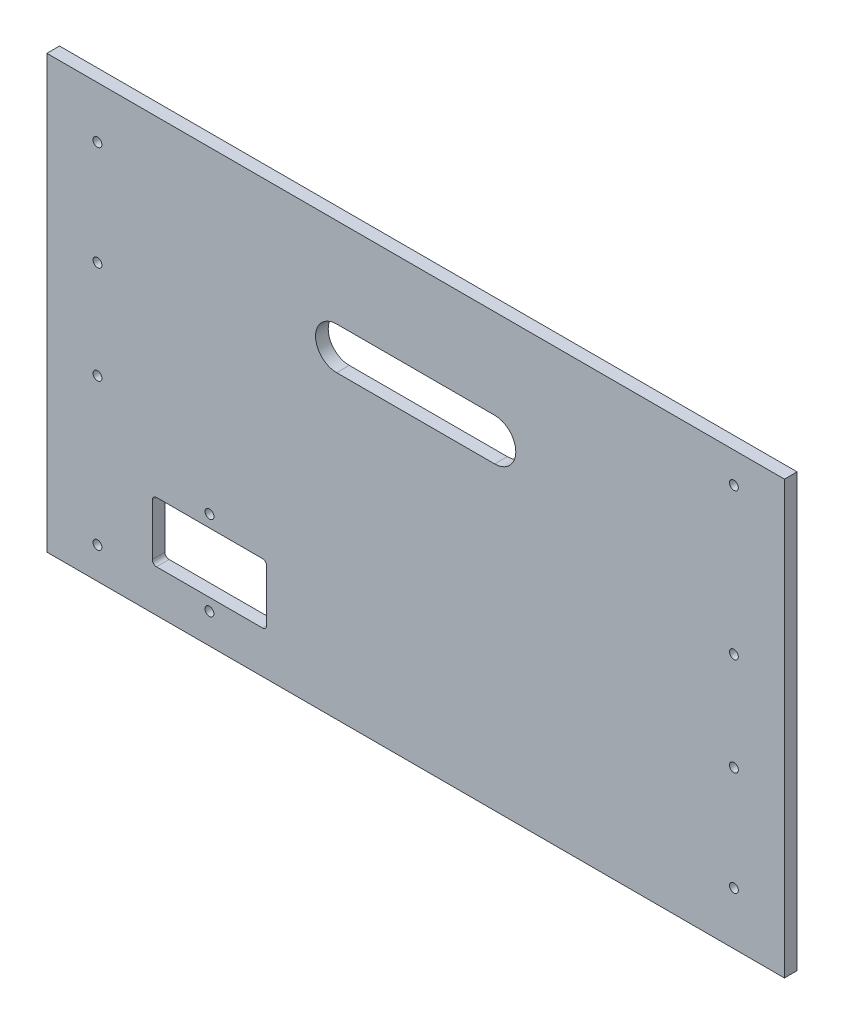
ISO-10303-21;
HEADER;
FILE_DESCRIPTION(('STEP AP214'),'2;1');
FILE_NAME('part.step','',(''),(''),'','','');
FILE_SCHEMA(('AUTOMOTIVE_DESIGN { 1 0 10303 214 1 1 1 1 }'));
ENDSEC;
DATA;
#1=APPLICATION_CONTEXT('core data for automotive mechanical design processes');
#2=APPLICATION_PROTOCOL_DEFINITION('international standard','automotive_design',2000,#1);
#3=PRODUCT_CONTEXT('',#1,'mechanical');
#4=PRODUCT('Part','Part','',(#3));
#5=PRODUCT_RELATED_PRODUCT_CATEGORY('part','',(#4));
#6=PRODUCT_DEFINITION_FORMATION('','',#4);
#7=PRODUCT_DEFINITION_CONTEXT('part definition',#1,'design');
#8=PRODUCT_DEFINITION('design','',#6,#7);
#9=PRODUCT_DEFINITION_SHAPE('','',#8);
#10=(LENGTH_UNIT() NAMED_UNIT(*) SI_UNIT(.MILLI.,.METRE.));
#11=(NAMED_UNIT(*) PLANE_ANGLE_UNIT() SI_UNIT($,.RADIAN.));
#12=(NAMED_UNIT(*) SI_UNIT($,.STERADIAN.) SOLID_ANGLE_UNIT());
#13=UNCERTAINTY_MEASURE_WITH_UNIT(LENGTH_MEASURE(1.E-05),#10,'distance_accuracy_value','');
#14=(GEOMETRIC_REPRESENTATION_CONTEXT(3) GLOBAL_UNCERTAINTY_ASSIGNED_CONTEXT((#13)) GLOBAL_UNIT_ASSIGNED_CONTEXT((#10,
#11,#12)) REPRESENTATION_CONTEXT('',''));
#15=CARTESIAN_POINT('',(0.,0.,0.));
#16=DIRECTION('',(0.,0.,1.));
#17=DIRECTION('',(1.,0.,0.));
#18=AXIS2_PLACEMENT_3D('',#15,#16,#17);
#19=CARTESIAN_POINT('',(0.,-102.5,6.));
#20=DIRECTION('',(0.,1.,0.));
#21=DIRECTION('',(0.,0.,1.));
#22=AXIS2_PLACEMENT_3D('',#19,#20,#21);
#23=PLANE('',#22);
#24=DIRECTION('',(1.,0.,0.));
#25=VECTOR('',#24,1.);
#26=CARTESIAN_POINT('',(0.,-102.5,0.));
#27=LINE('',#26,#25);
#28=CARTESIAN_POINT('',(-175.,-102.5,0.));
#29=VERTEX_POINT('',#28);
#30=CARTESIAN_POINT('',(175.,-102.5,0.));
#31=VERTEX_POINT('',#30);
#32=EDGE_CURVE('E249',#29,#31,#27,.T.);
#33=ORIENTED_EDGE('',*,*,#32,.T.);
#34=DIRECTION('',(0.,0.,-1.));
#35=VECTOR('',#34,1.);
#36=CARTESIAN_POINT('',(175.,-102.5,6.));
#37=LINE('',#36,#35);
#38=CARTESIAN_POINT('',(175.,-102.5,6.));
#39=VERTEX_POINT('',#38);
#40=EDGE_CURVE('E11',#39,#31,#37,.T.);
#41=ORIENTED_EDGE('',*,*,#40,.F.);
#42=DIRECTION('',(1.,0.,0.));
#43=VECTOR('',#42,1.);
#44=CARTESIAN_POINT('',(0.,-102.5,6.));
#45=LINE('',#44,#43);
#46=CARTESIAN_POINT('',(-175.,-102.5,6.));
#47=VERTEX_POINT('',#46);
#48=EDGE_CURVE('E256',#47,#39,#45,.T.);
#49=ORIENTED_EDGE('',*,*,#48,.F.);
#50=DIRECTION('',(0.,0.,-1.));
#51=VECTOR('',#50,1.);
#52=CARTESIAN_POINT('',(-175.,-102.5,6.));
#53=LINE('',#52,#51);
#54=EDGE_CURVE('E268',#47,#29,#53,.T.);
#55=ORIENTED_EDGE('',*,*,#54,.T.);
#56=EDGE_LOOP('',(#33,#41,#49,#55));
#57=FACE_BOUND('',#56,.T.);
#58=ADVANCED_FACE('F39',(#57),#23,.F.);
#59=CARTESIAN_POINT('',(175.,0.,6.));
#60=DIRECTION('',(-1.,0.,0.));
#61=DIRECTION('',(0.,0.,1.));
#62=AXIS2_PLACEMENT_3D('',#59,#60,#61);
#63=PLANE('',#62);
#64=DIRECTION('',(0.,1.,0.));
#65=VECTOR('',#64,1.);
#66=CARTESIAN_POINT('',(175.,0.,0.));
#67=LINE('',#66,#65);
#68=CARTESIAN_POINT('',(175.,102.5,0.));
#69=VERTEX_POINT('',#68);
#70=EDGE_CURVE('E271',#31,#69,#67,.T.);
#71=ORIENTED_EDGE('',*,*,#70,.T.);
#72=DIRECTION('',(0.,0.,-1.));
#73=VECTOR('',#72,1.);
#74=CARTESIAN_POINT('',(175.,102.5,6.));
#75=LINE('',#74,#73);
#76=CARTESIAN_POINT('',(175.,102.5,6.));
#77=VERTEX_POINT('',#76);
#78=EDGE_CURVE('E46',#77,#69,#75,.T.);
#79=ORIENTED_EDGE('',*,*,#78,.F.);
#80=DIRECTION('',(0.,1.,0.));
#81=VECTOR('',#80,1.);
#82=CARTESIAN_POINT('',(175.,0.,6.));
#83=LINE('',#82,#81);
#84=EDGE_CURVE('E259',#39,#77,#83,.T.);
#85=ORIENTED_EDGE('',*,*,#84,.F.);
#86=ORIENTED_EDGE('',*,*,#40,.T.);
#87=EDGE_LOOP('',(#71,#79,#85,#86));
#88=FACE_BOUND('',#87,.T.);
#89=ADVANCED_FACE('F287',(#88),#63,.F.);
#90=CARTESIAN_POINT('',(0.,102.5,6.));
#91=DIRECTION('',(0.,1.,0.));
#92=DIRECTION('',(0.,0.,1.));
#93=AXIS2_PLACEMENT_3D('',#90,#91,#92);
#94=PLANE('',#93);
#95=DIRECTION('',(1.,0.,0.));
#96=VECTOR('',#95,1.);
#97=CARTESIAN_POINT('',(0.,102.5,0.));
#98=LINE('',#97,#96);
#99=CARTESIAN_POINT('',(-175.,102.5,0.));
#100=VERTEX_POINT('',#99);
#101=EDGE_CURVE('E274',#100,#69,#98,.T.);
#102=ORIENTED_EDGE('',*,*,#101,.F.);
#103=DIRECTION('',(0.,0.,-1.));
#104=VECTOR('',#103,1.);
#105=CARTESIAN_POINT('',(-175.,102.5,6.));
#106=LINE('',#105,#104);
#107=CARTESIAN_POINT('',(-175.,102.5,6.));
#108=VERTEX_POINT('',#107);
#109=EDGE_CURVE('E280',#108,#100,#106,.T.);
#110=ORIENTED_EDGE('',*,*,#109,.F.);
#111=DIRECTION('',(1.,0.,0.));
#112=VECTOR('',#111,1.);
#113=CARTESIAN_POINT('',(0.,102.5,6.));
#114=LINE('',#113,#112);
#115=EDGE_CURVE('E262',#108,#77,#114,.T.);
#116=ORIENTED_EDGE('',*,*,#115,.T.);
#117=ORIENTED_EDGE('',*,*,#78,.T.);
#118=EDGE_LOOP('',(#102,#110,#116,#117));
#119=FACE_BOUND('',#118,.T.);
#120=ADVANCED_FACE('F284',(#119),#94,.T.);
#121=CARTESIAN_POINT('',(-175.,0.,6.));
#122=DIRECTION('',(-1.,0.,0.));
#123=DIRECTION('',(0.,0.,1.));
#124=AXIS2_PLACEMENT_3D('',#121,#122,#123);
#125=PLANE('',#124);
#126=DIRECTION('',(0.,1.,0.));
#127=VECTOR('',#126,1.);
#128=CARTESIAN_POINT('',(-175.,0.,0.));
#129=LINE('',#128,#127);
#130=EDGE_CURVE('E260',#29,#100,#129,.T.);
#131=ORIENTED_EDGE('',*,*,#130,.F.);
#132=ORIENTED_EDGE('',*,*,#54,.F.);
#133=DIRECTION('',(0.,1.,0.));
#134=VECTOR('',#133,1.);
#135=CARTESIAN_POINT('',(-175.,0.,6.));
#136=LINE('',#135,#134);
#137=EDGE_CURVE('E265',#47,#108,#136,.T.);
#138=ORIENTED_EDGE('',*,*,#137,.T.);
#139=ORIENTED_EDGE('',*,*,#109,.T.);
#140=EDGE_LOOP('',(#131,#132,#138,#139));
#141=FACE_BOUND('',#140,.T.);
#142=ADVANCED_FACE('F293',(#141),#125,.T.);
#143=CARTESIAN_POINT('',(0.,0.,6.));
#144=DIRECTION('',(0.,0.,1.));
#145=DIRECTION('',(1.,0.,0.));
#146=AXIS2_PLACEMENT_3D('',#143,#144,#145);
#147=PLANE('',#146);
#148=CARTESIAN_POINT('',(-151.,-87.5,6.));
#149=DIRECTION('',(0.,0.,1.));
#150=DIRECTION('',(1.,0.,0.));
#151=AXIS2_PLACEMENT_3D('',#148,#149,#150);
#152=CIRCLE('',#151,2.09999999999999);
#153=CARTESIAN_POINT('',(-148.9,-87.5,6.));
#154=VERTEX_POINT('',#153);
#155=EDGE_CURVE('E406',#154,#154,#152,.T.);
#156=ORIENTED_EDGE('',*,*,#155,.F.);
#157=EDGE_LOOP('',(#156));
#158=FACE_BOUND('',#157,.T.);
#159=CARTESIAN_POINT('',(-151.,-17.9999999999999,6.));
#160=DIRECTION('',(0.,0.,1.));
#161=DIRECTION('',(1.,0.,0.));
#162=AXIS2_PLACEMENT_3D('',#159,#160,#161);
#163=CIRCLE('',#162,2.09999999999999);
#164=CARTESIAN_POINT('',(-148.9,-17.9999999999999,6.));
#165=VERTEX_POINT('',#164);
#166=EDGE_CURVE('E408',#165,#165,#163,.T.);
#167=ORIENTED_EDGE('',*,*,#166,.F.);
#168=EDGE_LOOP('',(#167));
#169=FACE_BOUND('',#168,.T.);
#170=CARTESIAN_POINT('',(151.,-28.,6.));
#171=DIRECTION('',(0.,0.,1.));
#172=DIRECTION('',(1.,0.,0.));
#173=AXIS2_PLACEMENT_3D('',#170,#171,#172);
#174=CIRCLE('',#173,2.09999999999999);
#175=CARTESIAN_POINT('',(153.1,-28.,6.));
#176=VERTEX_POINT('',#175);
#177=EDGE_CURVE('E416',#176,#176,#174,.T.);
#178=ORIENTED_EDGE('',*,*,#177,.F.);
#179=EDGE_LOOP('',(#178));
#180=FACE_BOUND('',#179,.T.);
#181=CARTESIAN_POINT('',(151.,-77.5,6.));
#182=DIRECTION('',(0.,0.,1.));
#183=DIRECTION('',(1.,0.,0.));
#184=AXIS2_PLACEMENT_3D('',#181,#182,#183);
#185=CIRCLE('',#184,2.09999999999999);
#186=CARTESIAN_POINT('',(153.1,-77.5,6.));
#187=VERTEX_POINT('',#186);
#188=EDGE_CURVE('E422',#187,#187,#185,.T.);
#189=ORIENTED_EDGE('',*,*,#188,.F.);
#190=EDGE_LOOP('',(#189));
#191=FACE_BOUND('',#190,.T.);
#192=CARTESIAN_POINT('',(151.,88.,6.));
#193=DIRECTION('',(0.,0.,1.));
#194=DIRECTION('',(1.,0.,0.));
#195=AXIS2_PLACEMENT_3D('',#192,#193,#194);
#196=CIRCLE('',#195,2.09999999999999);
#197=CARTESIAN_POINT('',(153.1,88.,6.));
#198=VERTEX_POINT('',#197);
#199=EDGE_CURVE('E428',#198,#198,#196,.T.);
#200=ORIENTED_EDGE('',*,*,#199,.F.);
#201=EDGE_LOOP('',(#200));
#202=FACE_BOUND('',#201,.T.);
#203=CARTESIAN_POINT('',(151.,18.5,6.));
#204=DIRECTION('',(0.,0.,1.));
#205=DIRECTION('',(1.,0.,0.));
#206=AXIS2_PLACEMENT_3D('',#203,#204,#205);
#207=CIRCLE('',#206,2.09999999999999);
#208=CARTESIAN_POINT('',(153.1,18.5,6.));
#209=VERTEX_POINT('',#208);
#210=EDGE_CURVE('E434',#209,#209,#207,.T.);
#211=ORIENTED_EDGE('',*,*,#210,.F.);
#212=EDGE_LOOP('',(#211));
#213=FACE_BOUND('',#212,.T.);
#214=CARTESIAN_POINT('',(-151.000000000001,78.0000000000001,6.));
#215=DIRECTION('',(0.,0.,1.));
#216=DIRECTION('',(1.,0.,0.));
#217=AXIS2_PLACEMENT_3D('',#214,#215,#216);
#218=CIRCLE('',#217,2.09999999999999);
#219=CARTESIAN_POINT('',(-148.900000000001,78.0000000000001,6.));
#220=VERTEX_POINT('',#219);
#221=EDGE_CURVE('E440',#220,#220,#218,.T.);
#222=ORIENTED_EDGE('',*,*,#221,.F.);
#223=EDGE_LOOP('',(#222));
#224=FACE_BOUND('',#223,.T.);
#225=CARTESIAN_POINT('',(-151.000000000001,28.5000000000001,6.));
#226=DIRECTION('',(0.,0.,1.));
#227=DIRECTION('',(1.,0.,0.));
#228=AXIS2_PLACEMENT_3D('',#225,#226,#227);
#229=CIRCLE('',#228,2.09999999999999);
#230=CARTESIAN_POINT('',(-148.900000000001,28.5000000000001,6.));
#231=VERTEX_POINT('',#230);
#232=EDGE_CURVE('E446',#231,#231,#229,.T.);
#233=ORIENTED_EDGE('',*,*,#232,.F.);
#234=EDGE_LOOP('',(#233));
#235=FACE_BOUND('',#234,.T.);
#236=CARTESIAN_POINT('',(-97.8500000000001,-88.25,6.));
#237=DIRECTION('',(0.,0.,1.));
#238=DIRECTION('',(1.,0.,0.));
#239=AXIS2_PLACEMENT_3D('',#236,#237,#238);
#240=CIRCLE('',#239,2.1);
#241=CARTESIAN_POINT('',(-95.75,-88.25,6.));
#242=VERTEX_POINT('',#241);
#243=EDGE_CURVE('E456',#242,#242,#240,.T.);
#244=ORIENTED_EDGE('',*,*,#243,.F.);
#245=EDGE_LOOP('',(#244));
#246=FACE_BOUND('',#245,.T.);
#247=CARTESIAN_POINT('',(-97.8500000000001,-48.25,6.));
#248=DIRECTION('',(0.,0.,1.));
#249=DIRECTION('',(1.,0.,0.));
#250=AXIS2_PLACEMENT_3D('',#247,#248,#249);
#251=CIRCLE('',#250,2.1);
#252=CARTESIAN_POINT('',(-95.7500000000001,-48.25,6.));
#253=VERTEX_POINT('',#252);
#254=EDGE_CURVE('E194',#253,#253,#251,.T.);
#255=ORIENTED_EDGE('',*,*,#254,.F.);
#256=EDGE_LOOP('',(#255));
#257=FACE_BOUND('',#256,.T.);
#258=CARTESIAN_POINT('',(-123.,-80.5,6.));
#259=DIRECTION('',(0.,0.,1.));
#260=DIRECTION('',(-1.,0.,0.));
#261=AXIS2_PLACEMENT_3D('',#258,#259,#260);
#262=CIRCLE('',#261,2.);
#263=CARTESIAN_POINT('',(-125.,-80.5,6.));
#264=VERTEX_POINT('',#263);
#265=CARTESIAN_POINT('',(-123.,-82.5,6.));
#266=VERTEX_POINT('',#265);
#267=EDGE_CURVE('E53',#264,#266,#262,.T.);
#268=ORIENTED_EDGE('',*,*,#267,.F.);
#269=DIRECTION('',(0.,-1.,0.));
#270=VECTOR('',#269,1.);
#271=CARTESIAN_POINT('',(-125.,-80.5,6.));
#272=LINE('',#271,#270);
#273=CARTESIAN_POINT('',(-125.,-56.,6.));
#274=VERTEX_POINT('',#273);
#275=EDGE_CURVE('E170',#274,#264,#272,.T.);
#276=ORIENTED_EDGE('',*,*,#275,.F.);
#277=CARTESIAN_POINT('',(-123.,-56.,6.));
#278=DIRECTION('',(0.,0.,1.));
#279=DIRECTION('',(-1.,0.,0.));
#280=AXIS2_PLACEMENT_3D('',#277,#278,#279);
#281=CIRCLE('',#280,2.);
#282=CARTESIAN_POINT('',(-123.,-54.,6.));
#283=VERTEX_POINT('',#282);
#284=EDGE_CURVE('E173',#283,#274,#281,.T.);
#285=ORIENTED_EDGE('',*,*,#284,.F.);
#286=DIRECTION('',(-1.,0.,0.));
#287=VECTOR('',#286,1.);
#288=CARTESIAN_POINT('',(-123.,-54.,6.));
#289=LINE('',#288,#287);
#290=CARTESIAN_POINT('',(-72.7000000000001,-54.,6.));
#291=VERTEX_POINT('',#290);
#292=EDGE_CURVE('E205',#291,#283,#289,.T.);
#293=ORIENTED_EDGE('',*,*,#292,.F.);
#294=CARTESIAN_POINT('',(-72.7000000000001,-56.,6.));
#295=DIRECTION('',(0.,0.,1.));
#296=DIRECTION('',(-1.,0.,0.));
#297=AXIS2_PLACEMENT_3D('',#294,#295,#296);
#298=CIRCLE('',#297,2.);
#299=CARTESIAN_POINT('',(-70.7000000000001,-56.,6.));
#300=VERTEX_POINT('',#299);
#301=EDGE_CURVE('E202',#300,#291,#298,.T.);
#302=ORIENTED_EDGE('',*,*,#301,.F.);
#303=DIRECTION('',(0.,1.,0.));
#304=VECTOR('',#303,1.);
#305=CARTESIAN_POINT('',(-70.7000000000001,-80.5,6.));
#306=LINE('',#305,#304);
#307=CARTESIAN_POINT('',(-70.7000000000001,-80.5,6.));
#308=VERTEX_POINT('',#307);
#309=EDGE_CURVE('E199',#308,#300,#306,.T.);
#310=ORIENTED_EDGE('',*,*,#309,.F.);
#311=CARTESIAN_POINT('',(-72.7000000000001,-80.5,6.));
#312=DIRECTION('',(0.,0.,1.));
#313=DIRECTION('',(1.,0.,0.));
#314=AXIS2_PLACEMENT_3D('',#311,#312,#313);
#315=CIRCLE('',#314,2.);
#316=CARTESIAN_POINT('',(-72.7000000000001,-82.5,6.));
#317=VERTEX_POINT('',#316);
#318=EDGE_CURVE('E196',#317,#308,#315,.T.);
#319=ORIENTED_EDGE('',*,*,#318,.F.);
#320=DIRECTION('',(1.,0.,0.));
#321=VECTOR('',#320,1.);
#322=CARTESIAN_POINT('',(-123.,-82.5,6.));
#323=LINE('',#322,#321);
#324=EDGE_CURVE('E193',#266,#317,#323,.T.);
#325=ORIENTED_EDGE('',*,*,#324,.F.);
#326=EDGE_LOOP('',(#268,#276,#285,#293,#302,#310,#319,#325));
#327=FACE_BOUND('',#326,.T.);
#328=CARTESIAN_POINT('',(-37.5,50.,6.));
#329=DIRECTION('',(0.,0.,1.));
#330=DIRECTION('',(1.,0.,0.));
#331=AXIS2_PLACEMENT_3D('',#328,#329,#330);
#332=CIRCLE('',#331,10.);
#333=CARTESIAN_POINT('',(-37.5,60.,6.));
#334=VERTEX_POINT('',#333);
#335=CARTESIAN_POINT('',(-37.5,40.,6.));
#336=VERTEX_POINT('',#335);
#337=EDGE_CURVE('E212',#334,#336,#332,.T.);
#338=ORIENTED_EDGE('',*,*,#337,.F.);
#339=DIRECTION('',(-1.,0.,0.));
#340=VECTOR('',#339,1.);
#341=CARTESIAN_POINT('',(-37.5,60.,6.));
#342=LINE('',#341,#340);
#343=CARTESIAN_POINT('',(37.5,60.,6.));
#344=VERTEX_POINT('',#343);
#345=EDGE_CURVE('E228',#344,#334,#342,.T.);
#346=ORIENTED_EDGE('',*,*,#345,.F.);
#347=CARTESIAN_POINT('',(37.5,50.,6.));
#348=DIRECTION('',(0.,0.,1.));
#349=DIRECTION('',(1.,0.,0.));
#350=AXIS2_PLACEMENT_3D('',#347,#348,#349);
#351=CIRCLE('',#350,10.);
#352=CARTESIAN_POINT('',(37.5,40.,6.));
#353=VERTEX_POINT('',#352);
#354=EDGE_CURVE('E242',#353,#344,#351,.T.);
#355=ORIENTED_EDGE('',*,*,#354,.F.);
#356=DIRECTION('',(1.,0.,0.));
#357=VECTOR('',#356,1.);
#358=CARTESIAN_POINT('',(-37.5,40.,6.));
#359=LINE('',#358,#357);
#360=EDGE_CURVE('E239',#336,#353,#359,.T.);
#361=ORIENTED_EDGE('',*,*,#360,.F.);
#362=EDGE_LOOP('',(#338,#346,#355,#361));
#363=FACE_BOUND('',#362,.T.);
#364=ORIENTED_EDGE('',*,*,#48,.T.);
#365=ORIENTED_EDGE('',*,*,#84,.T.);
#366=ORIENTED_EDGE('',*,*,#115,.F.);
#367=ORIENTED_EDGE('',*,*,#137,.F.);
#368=EDGE_LOOP('',(#364,#365,#366,#367));
#369=FACE_BOUND('',#368,.T.);
#370=ADVANCED_FACE('F297',(#158,#169,#180,#191,#202,#213,#224,#235,#246,#257,#327,#363,#369),
#147,.T.);
#371=CARTESIAN_POINT('',(0.,0.,0.));
#372=DIRECTION('',(0.,0.,1.));
#373=DIRECTION('',(1.,0.,0.));
#374=AXIS2_PLACEMENT_3D('',#371,#372,#373);
#375=PLANE('',#374);
#376=CARTESIAN_POINT('',(-151.,-87.5,0.));
#377=DIRECTION('',(0.,0.,1.));
#378=DIRECTION('',(1.,0.,0.));
#379=AXIS2_PLACEMENT_3D('',#376,#377,#378);
#380=CIRCLE('',#379,2.09999999999999);
#381=CARTESIAN_POINT('',(-148.9,-87.5,0.));
#382=VERTEX_POINT('',#381);
#383=EDGE_CURVE('E403',#382,#382,#380,.T.);
#384=ORIENTED_EDGE('',*,*,#383,.T.);
#385=EDGE_LOOP('',(#384));
#386=FACE_BOUND('',#385,.T.);
#387=CARTESIAN_POINT('',(-151.,-17.9999999999999,0.));
#388=DIRECTION('',(0.,0.,1.));
#389=DIRECTION('',(1.,0.,0.));
#390=AXIS2_PLACEMENT_3D('',#387,#388,#389);
#391=CIRCLE('',#390,2.09999999999999);
#392=CARTESIAN_POINT('',(-148.9,-17.9999999999999,0.));
#393=VERTEX_POINT('',#392);
#394=EDGE_CURVE('E413',#393,#393,#391,.T.);
#395=ORIENTED_EDGE('',*,*,#394,.T.);
#396=EDGE_LOOP('',(#395));
#397=FACE_BOUND('',#396,.T.);
#398=CARTESIAN_POINT('',(151.,-28.,0.));
#399=DIRECTION('',(0.,0.,1.));
#400=DIRECTION('',(1.,0.,0.));
#401=AXIS2_PLACEMENT_3D('',#398,#399,#400);
#402=CIRCLE('',#401,2.09999999999999);
#403=CARTESIAN_POINT('',(153.1,-28.,0.));
#404=VERTEX_POINT('',#403);
#405=EDGE_CURVE('E419',#404,#404,#402,.T.);
#406=ORIENTED_EDGE('',*,*,#405,.T.);
#407=EDGE_LOOP('',(#406));
#408=FACE_BOUND('',#407,.T.);
#409=CARTESIAN_POINT('',(151.,-77.5,0.));
#410=DIRECTION('',(0.,0.,1.));
#411=DIRECTION('',(1.,0.,0.));
#412=AXIS2_PLACEMENT_3D('',#409,#410,#411);
#413=CIRCLE('',#412,2.09999999999999);
#414=CARTESIAN_POINT('',(153.1,-77.5,0.));
#415=VERTEX_POINT('',#414);
#416=EDGE_CURVE('E425',#415,#415,#413,.T.);
#417=ORIENTED_EDGE('',*,*,#416,.T.);
#418=EDGE_LOOP('',(#417));
#419=FACE_BOUND('',#418,.T.);
#420=CARTESIAN_POINT('',(151.,88.,0.));
#421=DIRECTION('',(0.,0.,1.));
#422=DIRECTION('',(1.,0.,0.));
#423=AXIS2_PLACEMENT_3D('',#420,#421,#422);
#424=CIRCLE('',#423,2.09999999999999);
#425=CARTESIAN_POINT('',(153.1,88.,0.));
#426=VERTEX_POINT('',#425);
#427=EDGE_CURVE('E431',#426,#426,#424,.T.);
#428=ORIENTED_EDGE('',*,*,#427,.T.);
#429=EDGE_LOOP('',(#428));
#430=FACE_BOUND('',#429,.T.);
#431=CARTESIAN_POINT('',(151.,18.5,0.));
#432=DIRECTION('',(0.,0.,1.));
#433=DIRECTION('',(1.,0.,0.));
#434=AXIS2_PLACEMENT_3D('',#431,#432,#433);
#435=CIRCLE('',#434,2.09999999999999);
#436=CARTESIAN_POINT('',(153.1,18.5,0.));
#437=VERTEX_POINT('',#436);
#438=EDGE_CURVE('E437',#437,#437,#435,.T.);
#439=ORIENTED_EDGE('',*,*,#438,.T.);
#440=EDGE_LOOP('',(#439));
#441=FACE_BOUND('',#440,.T.);
#442=CARTESIAN_POINT('',(-151.000000000001,78.0000000000001,0.));
#443=DIRECTION('',(0.,0.,1.));
#444=DIRECTION('',(1.,0.,0.));
#445=AXIS2_PLACEMENT_3D('',#442,#443,#444);
#446=CIRCLE('',#445,2.09999999999999);
#447=CARTESIAN_POINT('',(-148.900000000001,78.0000000000001,0.));
#448=VERTEX_POINT('',#447);
#449=EDGE_CURVE('E443',#448,#448,#446,.T.);
#450=ORIENTED_EDGE('',*,*,#449,.T.);
#451=EDGE_LOOP('',(#450));
#452=FACE_BOUND('',#451,.T.);
#453=CARTESIAN_POINT('',(-151.000000000001,28.5000000000001,0.));
#454=DIRECTION('',(0.,0.,1.));
#455=DIRECTION('',(1.,0.,0.));
#456=AXIS2_PLACEMENT_3D('',#453,#454,#455);
#457=CIRCLE('',#456,2.09999999999999);
#458=CARTESIAN_POINT('',(-148.900000000001,28.5000000000001,0.));
#459=VERTEX_POINT('',#458);
#460=EDGE_CURVE('E449',#459,#459,#457,.T.);
#461=ORIENTED_EDGE('',*,*,#460,.T.);
#462=EDGE_LOOP('',(#461));
#463=FACE_BOUND('',#462,.T.);
#464=CARTESIAN_POINT('',(-97.8500000000001,-88.25,0.));
#465=DIRECTION('',(0.,0.,1.));
#466=DIRECTION('',(1.,0.,0.));
#467=AXIS2_PLACEMENT_3D('',#464,#465,#466);
#468=CIRCLE('',#467,2.1);
#469=CARTESIAN_POINT('',(-95.75,-88.25,0.));
#470=VERTEX_POINT('',#469);
#471=EDGE_CURVE('E176',#470,#470,#468,.T.);
#472=ORIENTED_EDGE('',*,*,#471,.T.);
#473=EDGE_LOOP('',(#472));
#474=FACE_BOUND('',#473,.T.);
#475=CARTESIAN_POINT('',(-97.8500000000001,-48.25,0.));
#476=DIRECTION('',(0.,0.,1.));
#477=DIRECTION('',(1.,0.,0.));
#478=AXIS2_PLACEMENT_3D('',#475,#476,#477);
#479=CIRCLE('',#478,2.1);
#480=CARTESIAN_POINT('',(-95.7500000000001,-48.25,0.));
#481=VERTEX_POINT('',#480);
#482=EDGE_CURVE('E454',#481,#481,#479,.T.);
#483=ORIENTED_EDGE('',*,*,#482,.T.);
#484=EDGE_LOOP('',(#483));
#485=FACE_BOUND('',#484,.T.);
#486=DIRECTION('',(0.,-1.,0.));
#487=VECTOR('',#486,1.);
#488=CARTESIAN_POINT('',(-125.,-80.5,0.));
#489=LINE('',#488,#487);
#490=CARTESIAN_POINT('',(-125.,-56.,0.));
#491=VERTEX_POINT('',#490);
#492=CARTESIAN_POINT('',(-125.,-80.5,0.));
#493=VERTEX_POINT('',#492);
#494=EDGE_CURVE('E159',#491,#493,#489,.T.);
#495=ORIENTED_EDGE('',*,*,#494,.T.);
#496=CARTESIAN_POINT('',(-123.,-80.5,0.));
#497=DIRECTION('',(0.,0.,1.));
#498=DIRECTION('',(-1.,0.,0.));
#499=AXIS2_PLACEMENT_3D('',#496,#497,#498);
#500=CIRCLE('',#499,2.);
#501=CARTESIAN_POINT('',(-123.,-82.5,0.));
#502=VERTEX_POINT('',#501);
#503=EDGE_CURVE('E153',#493,#502,#500,.T.);
#504=ORIENTED_EDGE('',*,*,#503,.T.);
#505=DIRECTION('',(1.,0.,0.));
#506=VECTOR('',#505,1.);
#507=CARTESIAN_POINT('',(-123.,-82.5,0.));
#508=LINE('',#507,#506);
#509=CARTESIAN_POINT('',(-72.7000000000001,-82.5,0.));
#510=VERTEX_POINT('',#509);
#511=EDGE_CURVE('E162',#502,#510,#508,.T.);
#512=ORIENTED_EDGE('',*,*,#511,.T.);
#513=CARTESIAN_POINT('',(-72.7000000000001,-80.5,0.));
#514=DIRECTION('',(0.,0.,1.));
#515=DIRECTION('',(1.,0.,0.));
#516=AXIS2_PLACEMENT_3D('',#513,#514,#515);
#517=CIRCLE('',#516,2.);
#518=CARTESIAN_POINT('',(-70.7000000000001,-80.5,0.));
#519=VERTEX_POINT('',#518);
#520=EDGE_CURVE('E61',#510,#519,#517,.T.);
#521=ORIENTED_EDGE('',*,*,#520,.T.);
#522=DIRECTION('',(0.,1.,0.));
#523=VECTOR('',#522,1.);
#524=CARTESIAN_POINT('',(-70.7000000000001,-80.5,0.));
#525=LINE('',#524,#523);
#526=CARTESIAN_POINT('',(-70.7000000000001,-56.,0.));
#527=VERTEX_POINT('',#526);
#528=EDGE_CURVE('E180',#519,#527,#525,.T.);
#529=ORIENTED_EDGE('',*,*,#528,.T.);
#530=CARTESIAN_POINT('',(-72.7000000000001,-56.,0.));
#531=DIRECTION('',(0.,0.,1.));
#532=DIRECTION('',(-1.,0.,0.));
#533=AXIS2_PLACEMENT_3D('',#530,#531,#532);
#534=CIRCLE('',#533,2.);
#535=CARTESIAN_POINT('',(-72.7000000000001,-54.,0.));
#536=VERTEX_POINT('',#535);
#537=EDGE_CURVE('E183',#527,#536,#534,.T.);
#538=ORIENTED_EDGE('',*,*,#537,.T.);
#539=DIRECTION('',(-1.,0.,0.));
#540=VECTOR('',#539,1.);
#541=CARTESIAN_POINT('',(-123.,-54.,0.));
#542=LINE('',#541,#540);
#543=CARTESIAN_POINT('',(-123.,-54.,0.));
#544=VERTEX_POINT('',#543);
#545=EDGE_CURVE('E186',#536,#544,#542,.T.);
#546=ORIENTED_EDGE('',*,*,#545,.T.);
#547=CARTESIAN_POINT('',(-123.,-56.,0.));
#548=DIRECTION('',(0.,0.,1.));
#549=DIRECTION('',(-1.,0.,0.));
#550=AXIS2_PLACEMENT_3D('',#547,#548,#549);
#551=CIRCLE('',#550,2.);
#552=EDGE_CURVE('E189',#544,#491,#551,.T.);
#553=ORIENTED_EDGE('',*,*,#552,.T.);
#554=EDGE_LOOP('',(#495,#504,#512,#521,#529,#538,#546,#553));
#555=FACE_BOUND('',#554,.T.);
#556=DIRECTION('',(-1.,0.,0.));
#557=VECTOR('',#556,1.);
#558=CARTESIAN_POINT('',(-37.5,60.,0.));
#559=LINE('',#558,#557);
#560=CARTESIAN_POINT('',(37.5,60.,0.));
#561=VERTEX_POINT('',#560);
#562=CARTESIAN_POINT('',(-37.5,60.,0.));
#563=VERTEX_POINT('',#562);
#564=EDGE_CURVE('E234',#561,#563,#559,.T.);
#565=ORIENTED_EDGE('',*,*,#564,.T.);
#566=CARTESIAN_POINT('',(-37.5,50.,0.));
#567=DIRECTION('',(0.,0.,1.));
#568=DIRECTION('',(1.,0.,0.));
#569=AXIS2_PLACEMENT_3D('',#566,#567,#568);
#570=CIRCLE('',#569,10.);
#571=CARTESIAN_POINT('',(-37.5,40.,0.));
#572=VERTEX_POINT('',#571);
#573=EDGE_CURVE('E224',#563,#572,#570,.T.);
#574=ORIENTED_EDGE('',*,*,#573,.T.);
#575=DIRECTION('',(1.,0.,0.));
#576=VECTOR('',#575,1.);
#577=CARTESIAN_POINT('',(-37.5,40.,0.));
#578=LINE('',#577,#576);
#579=CARTESIAN_POINT('',(37.5,40.,0.));
#580=VERTEX_POINT('',#579);
#581=EDGE_CURVE('E227',#572,#580,#578,.T.);
#582=ORIENTED_EDGE('',*,*,#581,.T.);
#583=CARTESIAN_POINT('',(37.5,50.,0.));
#584=DIRECTION('',(0.,0.,1.));
#585=DIRECTION('',(1.,0.,0.));
#586=AXIS2_PLACEMENT_3D('',#583,#584,#585);
#587=CIRCLE('',#586,10.);
#588=EDGE_CURVE('E231',#580,#561,#587,.T.);
#589=ORIENTED_EDGE('',*,*,#588,.T.);
#590=EDGE_LOOP('',(#565,#574,#582,#589));
#591=FACE_BOUND('',#590,.T.);
#592=ORIENTED_EDGE('',*,*,#32,.F.);
#593=ORIENTED_EDGE('',*,*,#130,.T.);
#594=ORIENTED_EDGE('',*,*,#101,.T.);
#595=ORIENTED_EDGE('',*,*,#70,.F.);
#596=EDGE_LOOP('',(#592,#593,#594,#595));
#597=FACE_BOUND('',#596,.T.);
#598=ADVANCED_FACE('F166',(#386,#397,#408,#419,#430,#441,#452,#463,#474,#485,#555,#591,#597),
#375,.F.);
#599=CARTESIAN_POINT('',(-37.5,50.,0.));
#600=DIRECTION('',(0.,0.,1.));
#601=DIRECTION('',(1.,0.,0.));
#602=AXIS2_PLACEMENT_3D('',#599,#600,#601);
#603=CYLINDRICAL_SURFACE('',#602,10.);
#604=ORIENTED_EDGE('',*,*,#337,.T.);
#605=DIRECTION('',(0.,0.,1.));
#606=VECTOR('',#605,1.);
#607=CARTESIAN_POINT('',(-37.5,40.,0.));
#608=LINE('',#607,#606);
#609=EDGE_CURVE('E237',#572,#336,#608,.T.);
#610=ORIENTED_EDGE('',*,*,#609,.F.);
#611=ORIENTED_EDGE('',*,*,#573,.F.);
#612=DIRECTION('',(0.,0.,1.));
#613=VECTOR('',#612,1.);
#614=CARTESIAN_POINT('',(-37.5,60.,0.));
#615=LINE('',#614,#613);
#616=EDGE_CURVE('E247',#563,#334,#615,.T.);
#617=ORIENTED_EDGE('',*,*,#616,.T.);
#618=EDGE_LOOP('',(#604,#610,#611,#617));
#619=FACE_BOUND('',#618,.T.);
#620=ADVANCED_FACE('F312',(#619),#603,.F.);
#621=CARTESIAN_POINT('',(-37.5,60.,0.));
#622=DIRECTION('',(0.,1.,0.));
#623=DIRECTION('',(0.,0.,1.));
#624=AXIS2_PLACEMENT_3D('',#621,#622,#623);
#625=PLANE('',#624);
#626=ORIENTED_EDGE('',*,*,#345,.T.);
#627=ORIENTED_EDGE('',*,*,#616,.F.);
#628=ORIENTED_EDGE('',*,*,#564,.F.);
#629=DIRECTION('',(0.,0.,1.));
#630=VECTOR('',#629,1.);
#631=CARTESIAN_POINT('',(37.5,60.,0.));
#632=LINE('',#631,#630);
#633=EDGE_CURVE('E250',#561,#344,#632,.T.);
#634=ORIENTED_EDGE('',*,*,#633,.T.);
#635=EDGE_LOOP('',(#626,#627,#628,#634));
#636=FACE_BOUND('',#635,.T.);
#637=ADVANCED_FACE('F319',(#636),#625,.F.);
#638=CARTESIAN_POINT('',(37.5,50.,0.));
#639=DIRECTION('',(0.,0.,1.));
#640=DIRECTION('',(1.,0.,0.));
#641=AXIS2_PLACEMENT_3D('',#638,#639,#640);
#642=CYLINDRICAL_SURFACE('',#641,10.);
#643=ORIENTED_EDGE('',*,*,#354,.T.);
#644=ORIENTED_EDGE('',*,*,#633,.F.);
#645=ORIENTED_EDGE('',*,*,#588,.F.);
#646=DIRECTION('',(0.,0.,1.));
#647=VECTOR('',#646,1.);
#648=CARTESIAN_POINT('',(37.5,40.,0.));
#649=LINE('',#648,#647);
#650=EDGE_CURVE('E252',#580,#353,#649,.T.);
#651=ORIENTED_EDGE('',*,*,#650,.T.);
#652=EDGE_LOOP('',(#643,#644,#645,#651));
#653=FACE_BOUND('',#652,.T.);
#654=ADVANCED_FACE('F324',(#653),#642,.F.);
#655=CARTESIAN_POINT('',(-37.5,40.,0.));
#656=DIRECTION('',(0.,-1.,0.));
#657=DIRECTION('',(0.,0.,-1.));
#658=AXIS2_PLACEMENT_3D('',#655,#656,#657);
#659=PLANE('',#658);
#660=ORIENTED_EDGE('',*,*,#360,.T.);
#661=ORIENTED_EDGE('',*,*,#650,.F.);
#662=ORIENTED_EDGE('',*,*,#581,.F.);
#663=ORIENTED_EDGE('',*,*,#609,.T.);
#664=EDGE_LOOP('',(#660,#661,#662,#663));
#665=FACE_BOUND('',#664,.T.);
#666=ADVANCED_FACE('F321',(#665),#659,.F.);
#667=CARTESIAN_POINT('',(-123.,-80.5,0.));
#668=DIRECTION('',(0.,0.,1.));
#669=DIRECTION('',(1.,0.,0.));
#670=AXIS2_PLACEMENT_3D('',#667,#668,#669);
#671=CYLINDRICAL_SURFACE('',#670,2.);
#672=ORIENTED_EDGE('',*,*,#267,.T.);
#673=DIRECTION('',(0.,0.,1.));
#674=VECTOR('',#673,1.);
#675=CARTESIAN_POINT('',(-123.,-82.5,0.));
#676=LINE('',#675,#674);
#677=EDGE_CURVE('E149',#502,#266,#676,.T.);
#678=ORIENTED_EDGE('',*,*,#677,.F.);
#679=ORIENTED_EDGE('',*,*,#503,.F.);
#680=DIRECTION('',(0.,0.,1.));
#681=VECTOR('',#680,1.);
#682=CARTESIAN_POINT('',(-125.,-80.5,0.));
#683=LINE('',#682,#681);
#684=EDGE_CURVE('E210',#493,#264,#683,.T.);
#685=ORIENTED_EDGE('',*,*,#684,.T.);
#686=EDGE_LOOP('',(#672,#678,#679,#685));
#687=FACE_BOUND('',#686,.T.);
#688=ADVANCED_FACE('F151',(#687),#671,.F.);
#689=CARTESIAN_POINT('',(-125.,-80.5,0.));
#690=DIRECTION('',(-1.,0.,0.));
#691=DIRECTION('',(0.,0.,1.));
#692=AXIS2_PLACEMENT_3D('',#689,#690,#691);
#693=PLANE('',#692);
#694=ORIENTED_EDGE('',*,*,#275,.T.);
#695=ORIENTED_EDGE('',*,*,#684,.F.);
#696=ORIENTED_EDGE('',*,*,#494,.F.);
#697=DIRECTION('',(0.,0.,1.));
#698=VECTOR('',#697,1.);
#699=CARTESIAN_POINT('',(-125.,-56.,0.));
#700=LINE('',#699,#698);
#701=EDGE_CURVE('E213',#491,#274,#700,.T.);
#702=ORIENTED_EDGE('',*,*,#701,.T.);
#703=EDGE_LOOP('',(#694,#695,#696,#702));
#704=FACE_BOUND('',#703,.T.);
#705=ADVANCED_FACE('F334',(#704),#693,.F.);
#706=CARTESIAN_POINT('',(-123.,-56.,0.));
#707=DIRECTION('',(0.,0.,1.));
#708=DIRECTION('',(1.,0.,0.));
#709=AXIS2_PLACEMENT_3D('',#706,#707,#708);
#710=CYLINDRICAL_SURFACE('',#709,2.);
#711=ORIENTED_EDGE('',*,*,#284,.T.);
#712=ORIENTED_EDGE('',*,*,#701,.F.);
#713=ORIENTED_EDGE('',*,*,#552,.F.);
#714=DIRECTION('',(0.,0.,1.));
#715=VECTOR('',#714,1.);
#716=CARTESIAN_POINT('',(-123.,-54.,0.));
#717=LINE('',#716,#715);
#718=EDGE_CURVE('E215',#544,#283,#717,.T.);
#719=ORIENTED_EDGE('',*,*,#718,.T.);
#720=EDGE_LOOP('',(#711,#712,#713,#719));
#721=FACE_BOUND('',#720,.T.);
#722=ADVANCED_FACE('F352',(#721),#710,.F.);
#723=CARTESIAN_POINT('',(-123.,-54.,0.));
#724=DIRECTION('',(0.,1.,0.));
#725=DIRECTION('',(0.,0.,1.));
#726=AXIS2_PLACEMENT_3D('',#723,#724,#725);
#727=PLANE('',#726);
#728=ORIENTED_EDGE('',*,*,#292,.T.);
#729=ORIENTED_EDGE('',*,*,#718,.F.);
#730=ORIENTED_EDGE('',*,*,#545,.F.);
#731=DIRECTION('',(0.,0.,1.));
#732=VECTOR('',#731,1.);
#733=CARTESIAN_POINT('',(-72.7000000000001,-54.,0.));
#734=LINE('',#733,#732);
#735=EDGE_CURVE('E217',#536,#291,#734,.T.);
#736=ORIENTED_EDGE('',*,*,#735,.T.);
#737=EDGE_LOOP('',(#728,#729,#730,#736));
#738=FACE_BOUND('',#737,.T.);
#739=ADVANCED_FACE('F348',(#738),#727,.F.);
#740=CARTESIAN_POINT('',(-72.7000000000001,-56.,0.));
#741=DIRECTION('',(0.,0.,1.));
#742=DIRECTION('',(1.,0.,0.));
#743=AXIS2_PLACEMENT_3D('',#740,#741,#742);
#744=CYLINDRICAL_SURFACE('',#743,2.);
#745=ORIENTED_EDGE('',*,*,#301,.T.);
#746=ORIENTED_EDGE('',*,*,#735,.F.);
#747=ORIENTED_EDGE('',*,*,#537,.F.);
#748=DIRECTION('',(0.,0.,1.));
#749=VECTOR('',#748,1.);
#750=CARTESIAN_POINT('',(-70.7000000000001,-56.,0.));
#751=LINE('',#750,#749);
#752=EDGE_CURVE('E219',#527,#300,#751,.T.);
#753=ORIENTED_EDGE('',*,*,#752,.T.);
#754=EDGE_LOOP('',(#745,#746,#747,#753));
#755=FACE_BOUND('',#754,.T.);
#756=ADVANCED_FACE('F344',(#755),#744,.F.);
#757=CARTESIAN_POINT('',(-70.7000000000001,-80.5,0.));
#758=DIRECTION('',(1.,0.,0.));
#759=DIRECTION('',(0.,0.,-1.));
#760=AXIS2_PLACEMENT_3D('',#757,#758,#759);
#761=PLANE('',#760);
#762=ORIENTED_EDGE('',*,*,#309,.T.);
#763=ORIENTED_EDGE('',*,*,#752,.F.);
#764=ORIENTED_EDGE('',*,*,#528,.F.);
#765=DIRECTION('',(0.,0.,1.));
#766=VECTOR('',#765,1.);
#767=CARTESIAN_POINT('',(-70.7000000000001,-80.5,0.));
#768=LINE('',#767,#766);
#769=EDGE_CURVE('E221',#519,#308,#768,.T.);
#770=ORIENTED_EDGE('',*,*,#769,.T.);
#771=EDGE_LOOP('',(#762,#763,#764,#770));
#772=FACE_BOUND('',#771,.T.);
#773=ADVANCED_FACE('F341',(#772),#761,.F.);
#774=CARTESIAN_POINT('',(-72.7000000000001,-80.5,0.));
#775=DIRECTION('',(0.,0.,1.));
#776=DIRECTION('',(1.,0.,0.));
#777=AXIS2_PLACEMENT_3D('',#774,#775,#776);
#778=CYLINDRICAL_SURFACE('',#777,2.);
#779=ORIENTED_EDGE('',*,*,#318,.T.);
#780=ORIENTED_EDGE('',*,*,#769,.F.);
#781=ORIENTED_EDGE('',*,*,#520,.F.);
#782=DIRECTION('',(0.,0.,1.));
#783=VECTOR('',#782,1.);
#784=CARTESIAN_POINT('',(-72.7000000000001,-82.5,0.));
#785=LINE('',#784,#783);
#786=EDGE_CURVE('E158',#510,#317,#785,.T.);
#787=ORIENTED_EDGE('',*,*,#786,.T.);
#788=EDGE_LOOP('',(#779,#780,#781,#787));
#789=FACE_BOUND('',#788,.T.);
#790=ADVANCED_FACE('F338',(#789),#778,.F.);
#791=CARTESIAN_POINT('',(-123.,-82.5,0.));
#792=DIRECTION('',(0.,-1.,0.));
#793=DIRECTION('',(0.,0.,-1.));
#794=AXIS2_PLACEMENT_3D('',#791,#792,#793);
#795=PLANE('',#794);
#796=ORIENTED_EDGE('',*,*,#324,.T.);
#797=ORIENTED_EDGE('',*,*,#786,.F.);
#798=ORIENTED_EDGE('',*,*,#511,.F.);
#799=ORIENTED_EDGE('',*,*,#677,.T.);
#800=EDGE_LOOP('',(#796,#797,#798,#799));
#801=FACE_BOUND('',#800,.T.);
#802=ADVANCED_FACE('F163',(#801),#795,.F.);
#803=CARTESIAN_POINT('',(-97.8500000000001,-48.25,0.));
#804=DIRECTION('',(0.,0.,1.));
#805=DIRECTION('',(1.,0.,0.));
#806=AXIS2_PLACEMENT_3D('',#803,#804,#805);
#807=CYLINDRICAL_SURFACE('',#806,2.1);
#808=ORIENTED_EDGE('',*,*,#482,.F.);
#809=EDGE_LOOP('',(#808));
#810=FACE_BOUND('',#809,.T.);
#811=ORIENTED_EDGE('',*,*,#254,.T.);
#812=EDGE_LOOP('',(#811));
#813=FACE_BOUND('',#812,.T.);
#814=ADVANCED_FACE('F337',(#810,#813),#807,.F.);
#815=CARTESIAN_POINT('',(-97.8500000000001,-88.25,0.));
#816=DIRECTION('',(0.,0.,1.));
#817=DIRECTION('',(1.,0.,0.));
#818=AXIS2_PLACEMENT_3D('',#815,#816,#817);
#819=CYLINDRICAL_SURFACE('',#818,2.1);
#820=ORIENTED_EDGE('',*,*,#471,.F.);
#821=EDGE_LOOP('',(#820));
#822=FACE_BOUND('',#821,.T.);
#823=ORIENTED_EDGE('',*,*,#243,.T.);
#824=EDGE_LOOP('',(#823));
#825=FACE_BOUND('',#824,.T.);
#826=ADVANCED_FACE('F360',(#822,#825),#819,.F.);
#827=CARTESIAN_POINT('',(-151.000000000001,28.5000000000001,6.));
#828=DIRECTION('',(0.,0.,1.));
#829=DIRECTION('',(1.,0.,0.));
#830=AXIS2_PLACEMENT_3D('',#827,#828,#829);
#831=CYLINDRICAL_SURFACE('',#830,2.09999999999999);
#832=ORIENTED_EDGE('',*,*,#460,.F.);
#833=EDGE_LOOP('',(#832));
#834=FACE_BOUND('',#833,.T.);
#835=ORIENTED_EDGE('',*,*,#232,.T.);
#836=EDGE_LOOP('',(#835));
#837=FACE_BOUND('',#836,.T.);
#838=ADVANCED_FACE('F363',(#834,#837),#831,.F.);
#839=CARTESIAN_POINT('',(-151.000000000001,78.0000000000001,6.));
#840=DIRECTION('',(0.,0.,1.));
#841=DIRECTION('',(1.,0.,0.));
#842=AXIS2_PLACEMENT_3D('',#839,#840,#841);
#843=CYLINDRICAL_SURFACE('',#842,2.09999999999999);
#844=ORIENTED_EDGE('',*,*,#449,.F.);
#845=EDGE_LOOP('',(#844));
#846=FACE_BOUND('',#845,.T.);
#847=ORIENTED_EDGE('',*,*,#221,.T.);
#848=EDGE_LOOP('',(#847));
#849=FACE_BOUND('',#848,.T.);
#850=ADVANCED_FACE('F370',(#846,#849),#843,.F.);
#851=CARTESIAN_POINT('',(151.,18.5,6.));
#852=DIRECTION('',(0.,0.,1.));
#853=DIRECTION('',(1.,0.,0.));
#854=AXIS2_PLACEMENT_3D('',#851,#852,#853);
#855=CYLINDRICAL_SURFACE('',#854,2.09999999999999);
#856=ORIENTED_EDGE('',*,*,#438,.F.);
#857=EDGE_LOOP('',(#856));
#858=FACE_BOUND('',#857,.T.);
#859=ORIENTED_EDGE('',*,*,#210,.T.);
#860=EDGE_LOOP('',(#859));
#861=FACE_BOUND('',#860,.T.);
#862=ADVANCED_FACE('F374',(#858,#861),#855,.F.);
#863=CARTESIAN_POINT('',(151.,88.,6.));
#864=DIRECTION('',(0.,0.,1.));
#865=DIRECTION('',(1.,0.,0.));
#866=AXIS2_PLACEMENT_3D('',#863,#864,#865);
#867=CYLINDRICAL_SURFACE('',#866,2.09999999999999);
#868=ORIENTED_EDGE('',*,*,#427,.F.);
#869=EDGE_LOOP('',(#868));
#870=FACE_BOUND('',#869,.T.);
#871=ORIENTED_EDGE('',*,*,#199,.T.);
#872=EDGE_LOOP('',(#871));
#873=FACE_BOUND('',#872,.T.);
#874=ADVANCED_FACE('F378',(#870,#873),#867,.F.);
#875=CARTESIAN_POINT('',(151.,-77.5,6.));
#876=DIRECTION('',(0.,0.,1.));
#877=DIRECTION('',(1.,0.,0.));
#878=AXIS2_PLACEMENT_3D('',#875,#876,#877);
#879=CYLINDRICAL_SURFACE('',#878,2.09999999999999);
#880=ORIENTED_EDGE('',*,*,#416,.F.);
#881=EDGE_LOOP('',(#880));
#882=FACE_BOUND('',#881,.T.);
#883=ORIENTED_EDGE('',*,*,#188,.T.);
#884=EDGE_LOOP('',(#883));
#885=FACE_BOUND('',#884,.T.);
#886=ADVANCED_FACE('F382',(#882,#885),#879,.F.);
#887=CARTESIAN_POINT('',(151.,-28.,6.));
#888=DIRECTION('',(0.,0.,1.));
#889=DIRECTION('',(1.,0.,0.));
#890=AXIS2_PLACEMENT_3D('',#887,#888,#889);
#891=CYLINDRICAL_SURFACE('',#890,2.09999999999999);
#892=ORIENTED_EDGE('',*,*,#405,.F.);
#893=EDGE_LOOP('',(#892));
#894=FACE_BOUND('',#893,.T.);
#895=ORIENTED_EDGE('',*,*,#177,.T.);
#896=EDGE_LOOP('',(#895));
#897=FACE_BOUND('',#896,.T.);
#898=ADVANCED_FACE('F386',(#894,#897),#891,.F.);
#899=CARTESIAN_POINT('',(-151.,-17.9999999999999,6.));
#900=DIRECTION('',(0.,0.,1.));
#901=DIRECTION('',(1.,0.,0.));
#902=AXIS2_PLACEMENT_3D('',#899,#900,#901);
#903=CYLINDRICAL_SURFACE('',#902,2.09999999999999);
#904=ORIENTED_EDGE('',*,*,#394,.F.);
#905=EDGE_LOOP('',(#904));
#906=FACE_BOUND('',#905,.T.);
#907=ORIENTED_EDGE('',*,*,#166,.T.);
#908=EDGE_LOOP('',(#907));
#909=FACE_BOUND('',#908,.T.);
#910=ADVANCED_FACE('F390',(#906,#909),#903,.F.);
#911=CARTESIAN_POINT('',(-151.,-87.5,6.));
#912=DIRECTION('',(0.,0.,1.));
#913=DIRECTION('',(1.,0.,0.));
#914=AXIS2_PLACEMENT_3D('',#911,#912,#913);
#915=CYLINDRICAL_SURFACE('',#914,2.09999999999999);
#916=ORIENTED_EDGE('',*,*,#383,.F.);
#917=EDGE_LOOP('',(#916));
#918=FACE_BOUND('',#917,.T.);
#919=ORIENTED_EDGE('',*,*,#155,.T.);
#920=EDGE_LOOP('',(#919));
#921=FACE_BOUND('',#920,.T.);
#922=ADVANCED_FACE('F394',(#918,#921),#915,.F.);
#923=CLOSED_SHELL('',(#58,#89,#120,#142,#370,#598,#620,#637,#654,#666,#688,#705,#722,#739,#756,
#773,#790,#802,#814,#826,#838,#850,#862,#874,#886,#898,#910,#922));
#924=MANIFOLD_SOLID_BREP('B2',#923);
#925=ADVANCED_BREP_SHAPE_REPRESENTATION('',(#18,#924),#14);
#926=SHAPE_DEFINITION_REPRESENTATION(#9,#925);
ENDSEC;
END-ISO-10303-21;
